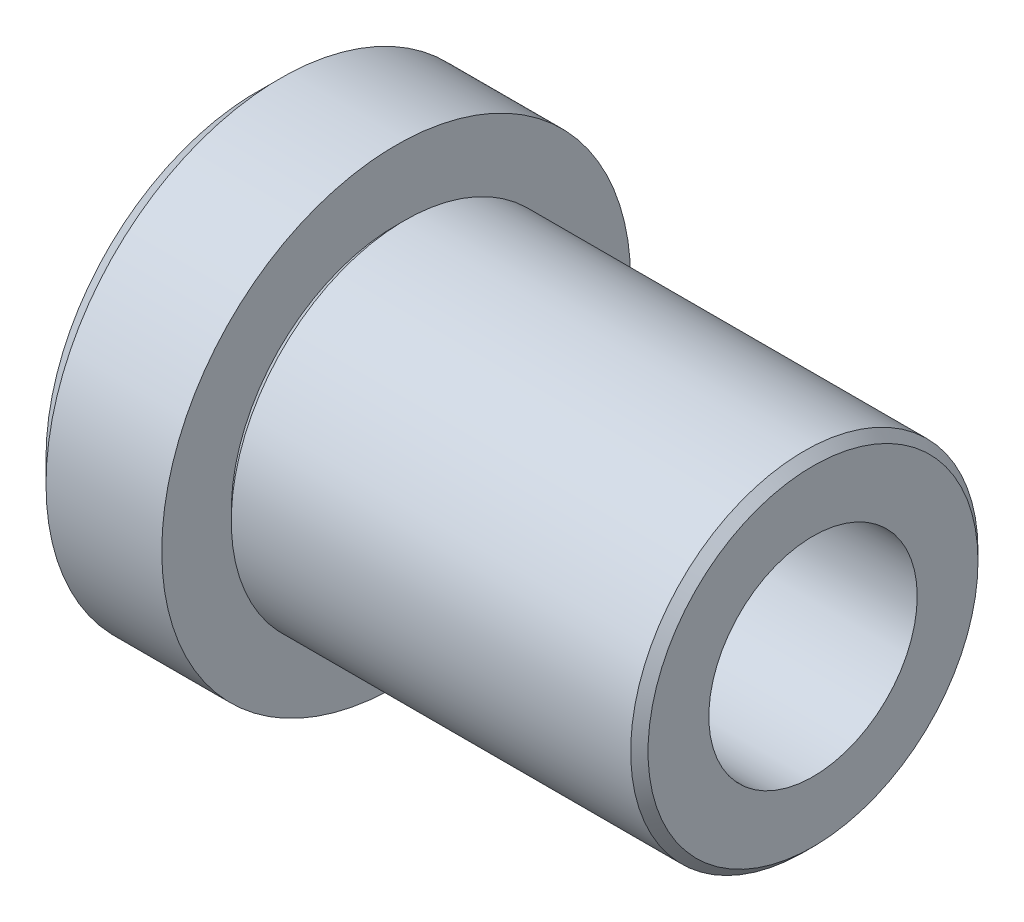
ISO-10303-21;
HEADER;
FILE_DESCRIPTION(('STEP AP214'),'2;1');
FILE_NAME('part.step','',(''),(''),'','','');
FILE_SCHEMA(('AUTOMOTIVE_DESIGN { 1 0 10303 214 1 1 1 1 }'));
ENDSEC;
DATA;
#1=APPLICATION_CONTEXT('core data for automotive mechanical design processes');
#2=APPLICATION_PROTOCOL_DEFINITION('international standard','automotive_design',2000,#1);
#3=PRODUCT_CONTEXT('',#1,'mechanical');
#4=PRODUCT('Part','Part','',(#3));
#5=PRODUCT_RELATED_PRODUCT_CATEGORY('part','',(#4));
#6=PRODUCT_DEFINITION_FORMATION('','',#4);
#7=PRODUCT_DEFINITION_CONTEXT('part definition',#1,'design');
#8=PRODUCT_DEFINITION('design','',#6,#7);
#9=PRODUCT_DEFINITION_SHAPE('','',#8);
#10=(LENGTH_UNIT() NAMED_UNIT(*) SI_UNIT(.MILLI.,.METRE.));
#11=(NAMED_UNIT(*) PLANE_ANGLE_UNIT() SI_UNIT($,.RADIAN.));
#12=(NAMED_UNIT(*) SI_UNIT($,.STERADIAN.) SOLID_ANGLE_UNIT());
#13=UNCERTAINTY_MEASURE_WITH_UNIT(LENGTH_MEASURE(1.E-05),#10,'distance_accuracy_value','');
#14=(GEOMETRIC_REPRESENTATION_CONTEXT(3) GLOBAL_UNCERTAINTY_ASSIGNED_CONTEXT((#13)) GLOBAL_UNIT_ASSIGNED_CONTEXT((#10,
#11,#12)) REPRESENTATION_CONTEXT('',''));
#15=CARTESIAN_POINT('',(0.,0.,0.));
#16=DIRECTION('',(0.,0.,1.));
#17=DIRECTION('',(1.,0.,0.));
#18=AXIS2_PLACEMENT_3D('',#15,#16,#17);
#19=CARTESIAN_POINT('',(6.35,0.,0.));
#20=DIRECTION('',(1.,0.,0.));
#21=DIRECTION('',(0.,0.,-1.));
#22=AXIS2_PLACEMENT_3D('',#19,#20,#21);
#23=CYLINDRICAL_SURFACE('',#22,2.38125);
#24=CARTESIAN_POINT('',(6.35000000000001,0.,0.));
#25=DIRECTION('',(1.,0.,0.));
#26=DIRECTION('',(0.,0.,-1.));
#27=AXIS2_PLACEMENT_3D('',#24,#25,#26);
#28=CIRCLE('',#27,2.38125);
#29=CARTESIAN_POINT('',(6.35000000000001,0.,-2.38125));
#30=VERTEX_POINT('',#29);
#31=EDGE_CURVE('E10',#30,#30,#28,.T.);
#32=ORIENTED_EDGE('',*,*,#31,.T.);
#33=EDGE_LOOP('',(#32));
#34=FACE_BOUND('',#33,.T.);
#35=CARTESIAN_POINT('',(-5.82083333333335,0.,0.));
#36=DIRECTION('',(1.,0.,0.));
#37=DIRECTION('',(0.,0.,-1.));
#38=AXIS2_PLACEMENT_3D('',#35,#36,#37);
#39=CIRCLE('',#38,2.38125);
#40=CARTESIAN_POINT('',(-5.82083333333335,0.,-2.38125));
#41=VERTEX_POINT('',#40);
#42=EDGE_CURVE('E72',#41,#41,#39,.T.);
#43=ORIENTED_EDGE('',*,*,#42,.F.);
#44=EDGE_LOOP('',(#43));
#45=FACE_BOUND('',#44,.T.);
#46=ADVANCED_FACE('F38',(#34,#45),#23,.F.);
#47=CARTESIAN_POINT('',(6.35000000000001,2.38125,0.));
#48=DIRECTION('',(1.,0.,0.));
#49=DIRECTION('',(0.,0.,-1.));
#50=AXIS2_PLACEMENT_3D('',#47,#48,#49);
#51=PLANE('',#50);
#52=CARTESIAN_POINT('',(6.35,0.,0.));
#53=DIRECTION('',(1.,0.,0.));
#54=DIRECTION('',(0.,0.,-1.));
#55=AXIS2_PLACEMENT_3D('',#52,#53,#54);
#56=CIRCLE('',#55,3.7703125);
#57=CARTESIAN_POINT('',(6.35,0.,-3.7703125));
#58=VERTEX_POINT('',#57);
#59=EDGE_CURVE('E44',#58,#58,#56,.T.);
#60=ORIENTED_EDGE('',*,*,#59,.T.);
#61=EDGE_LOOP('',(#60));
#62=FACE_BOUND('',#61,.T.);
#63=ORIENTED_EDGE('',*,*,#31,.F.);
#64=EDGE_LOOP('',(#63));
#65=FACE_BOUND('',#64,.T.);
#66=ADVANCED_FACE('F80',(#62,#65),#51,.T.);
#67=CARTESIAN_POINT('',(6.35,0.,0.));
#68=DIRECTION('',(-1.,0.,0.));
#69=DIRECTION('',(0.,0.,1.));
#70=AXIS2_PLACEMENT_3D('',#67,#68,#69);
#71=CONICAL_SURFACE('',#70,3.7703125,0.785398163397449);
#72=CARTESIAN_POINT('',(6.15156250000001,0.,0.));
#73=DIRECTION('',(1.,0.,0.));
#74=DIRECTION('',(0.,0.,-1.));
#75=AXIS2_PLACEMENT_3D('',#72,#73,#74);
#76=CIRCLE('',#75,3.96875);
#77=CARTESIAN_POINT('',(6.15156250000001,0.,-3.96875));
#78=VERTEX_POINT('',#77);
#79=EDGE_CURVE('E48',#78,#78,#76,.T.);
#80=ORIENTED_EDGE('',*,*,#79,.T.);
#81=EDGE_LOOP('',(#80));
#82=FACE_BOUND('',#81,.T.);
#83=ORIENTED_EDGE('',*,*,#59,.F.);
#84=EDGE_LOOP('',(#83));
#85=FACE_BOUND('',#84,.T.);
#86=ADVANCED_FACE('F84',(#82,#85),#71,.T.);
#87=CARTESIAN_POINT('',(6.35,0.,0.));
#88=DIRECTION('',(1.,0.,0.));
#89=DIRECTION('',(0.,0.,-1.));
#90=AXIS2_PLACEMENT_3D('',#87,#88,#89);
#91=CYLINDRICAL_SURFACE('',#90,3.96875);
#92=CARTESIAN_POINT('',(-2.97656250000001,0.,0.));
#93=DIRECTION('',(1.,0.,0.));
#94=DIRECTION('',(0.,0.,-1.));
#95=AXIS2_PLACEMENT_3D('',#92,#93,#94);
#96=CIRCLE('',#95,3.96875);
#97=CARTESIAN_POINT('',(-2.97656250000001,0.,-3.96875));
#98=VERTEX_POINT('',#97);
#99=EDGE_CURVE('E52',#98,#98,#96,.T.);
#100=ORIENTED_EDGE('',*,*,#99,.T.);
#101=EDGE_LOOP('',(#100));
#102=FACE_BOUND('',#101,.T.);
#103=ORIENTED_EDGE('',*,*,#79,.F.);
#104=EDGE_LOOP('',(#103));
#105=FACE_BOUND('',#104,.T.);
#106=ADVANCED_FACE('F88',(#102,#105),#91,.T.);
#107=CARTESIAN_POINT('',(-2.97656250000001,0.,0.));
#108=DIRECTION('',(1.,0.,0.));
#109=DIRECTION('',(0.,0.,-1.));
#110=AXIS2_PLACEMENT_3D('',#107,#108,#109);
#111=CONICAL_SURFACE('',#110,3.96875,0.785398163397458);
#112=CARTESIAN_POINT('',(-3.175,0.,0.));
#113=DIRECTION('',(1.,0.,0.));
#114=DIRECTION('',(0.,0.,-1.));
#115=AXIS2_PLACEMENT_3D('',#112,#113,#114);
#116=CIRCLE('',#115,3.7703125);
#117=CARTESIAN_POINT('',(-3.175,0.,-3.7703125));
#118=VERTEX_POINT('',#117);
#119=EDGE_CURVE('E57',#118,#118,#116,.T.);
#120=ORIENTED_EDGE('',*,*,#119,.T.);
#121=EDGE_LOOP('',(#120));
#122=FACE_BOUND('',#121,.T.);
#123=ORIENTED_EDGE('',*,*,#99,.F.);
#124=EDGE_LOOP('',(#123));
#125=FACE_BOUND('',#124,.T.);
#126=ADVANCED_FACE('F95',(#122,#125),#111,.T.);
#127=CARTESIAN_POINT('',(-3.175,3.7703125,0.));
#128=DIRECTION('',(1.,0.,0.));
#129=DIRECTION('',(0.,0.,-1.));
#130=AXIS2_PLACEMENT_3D('',#127,#128,#129);
#131=PLANE('',#130);
#132=CARTESIAN_POINT('',(-3.17500000000001,0.,0.));
#133=DIRECTION('',(1.,0.,0.));
#134=DIRECTION('',(0.,0.,-1.));
#135=AXIS2_PLACEMENT_3D('',#132,#133,#134);
#136=CIRCLE('',#135,5.35781249999999);
#137=CARTESIAN_POINT('',(-3.17500000000001,0.,-5.35781249999999));
#138=VERTEX_POINT('',#137);
#139=EDGE_CURVE('E60',#138,#138,#136,.T.);
#140=ORIENTED_EDGE('',*,*,#139,.T.);
#141=EDGE_LOOP('',(#140));
#142=FACE_BOUND('',#141,.T.);
#143=ORIENTED_EDGE('',*,*,#119,.F.);
#144=EDGE_LOOP('',(#143));
#145=FACE_BOUND('',#144,.T.);
#146=ADVANCED_FACE('F99',(#142,#145),#131,.T.);
#147=CARTESIAN_POINT('',(6.35,0.,0.));
#148=DIRECTION('',(1.,0.,0.));
#149=DIRECTION('',(0.,0.,-1.));
#150=AXIS2_PLACEMENT_3D('',#147,#148,#149);
#151=CYLINDRICAL_SURFACE('',#150,5.3578125);
#152=CARTESIAN_POINT('',(-5.82083333333334,0.,0.));
#153=DIRECTION('',(1.,0.,0.));
#154=DIRECTION('',(0.,0.,-1.));
#155=AXIS2_PLACEMENT_3D('',#152,#153,#154);
#156=CIRCLE('',#155,5.3578125);
#157=CARTESIAN_POINT('',(-5.82083333333334,0.,-5.3578125));
#158=VERTEX_POINT('',#157);
#159=EDGE_CURVE('E63',#158,#158,#156,.T.);
#160=ORIENTED_EDGE('',*,*,#159,.T.);
#161=EDGE_LOOP('',(#160));
#162=FACE_BOUND('',#161,.T.);
#163=ORIENTED_EDGE('',*,*,#139,.F.);
#164=EDGE_LOOP('',(#163));
#165=FACE_BOUND('',#164,.T.);
#166=ADVANCED_FACE('F103',(#162,#165),#151,.T.);
#167=CARTESIAN_POINT('',(-5.82083333333334,0.,0.));
#168=DIRECTION('',(1.,0.,0.));
#169=DIRECTION('',(0.,0.,-1.));
#170=AXIS2_PLACEMENT_3D('',#167,#168,#169);
#171=CONICAL_SURFACE('',#170,5.3578125,0.785398163397452);
#172=CARTESIAN_POINT('',(-6.35000000000001,0.,0.));
#173=DIRECTION('',(1.,0.,0.));
#174=DIRECTION('',(0.,0.,-1.));
#175=AXIS2_PLACEMENT_3D('',#172,#173,#174);
#176=CIRCLE('',#175,4.82864583333332);
#177=CARTESIAN_POINT('',(-6.35000000000001,0.,-4.82864583333332));
#178=VERTEX_POINT('',#177);
#179=EDGE_CURVE('E66',#178,#178,#176,.T.);
#180=ORIENTED_EDGE('',*,*,#179,.T.);
#181=EDGE_LOOP('',(#180));
#182=FACE_BOUND('',#181,.T.);
#183=ORIENTED_EDGE('',*,*,#159,.F.);
#184=EDGE_LOOP('',(#183));
#185=FACE_BOUND('',#184,.T.);
#186=ADVANCED_FACE('F107',(#182,#185),#171,.T.);
#187=CARTESIAN_POINT('',(-6.35000000000001,4.82864583333332,0.));
#188=DIRECTION('',(-1.,0.,0.));
#189=DIRECTION('',(0.,0.,1.));
#190=AXIS2_PLACEMENT_3D('',#187,#188,#189);
#191=PLANE('',#190);
#192=CARTESIAN_POINT('',(-6.35000000000001,0.,0.));
#193=DIRECTION('',(1.,0.,0.));
#194=DIRECTION('',(0.,0.,-1.));
#195=AXIS2_PLACEMENT_3D('',#192,#193,#194);
#196=CIRCLE('',#195,2.91041666666666);
#197=CARTESIAN_POINT('',(-6.35000000000001,0.,-2.91041666666666));
#198=VERTEX_POINT('',#197);
#199=EDGE_CURVE('E69',#198,#198,#196,.T.);
#200=ORIENTED_EDGE('',*,*,#199,.T.);
#201=EDGE_LOOP('',(#200));
#202=FACE_BOUND('',#201,.T.);
#203=ORIENTED_EDGE('',*,*,#179,.F.);
#204=EDGE_LOOP('',(#203));
#205=FACE_BOUND('',#204,.T.);
#206=ADVANCED_FACE('F111',(#202,#205),#191,.T.);
#207=CARTESIAN_POINT('',(-6.35000000000001,0.,0.));
#208=DIRECTION('',(-1.,0.,0.));
#209=DIRECTION('',(0.,0.,1.));
#210=AXIS2_PLACEMENT_3D('',#207,#208,#209);
#211=CONICAL_SURFACE('',#210,2.91041666666666,0.78539816339745);
#212=ORIENTED_EDGE('',*,*,#42,.T.);
#213=EDGE_LOOP('',(#212));
#214=FACE_BOUND('',#213,.T.);
#215=ORIENTED_EDGE('',*,*,#199,.F.);
#216=EDGE_LOOP('',(#215));
#217=FACE_BOUND('',#216,.T.);
#218=ADVANCED_FACE('F76',(#214,#217),#211,.F.);
#219=CLOSED_SHELL('',(#46,#66,#86,#106,#126,#146,#166,#186,#206,#218));
#220=MANIFOLD_SOLID_BREP('B2',#219);
#221=ADVANCED_BREP_SHAPE_REPRESENTATION('',(#18,#220),#14);
#222=SHAPE_DEFINITION_REPRESENTATION(#9,#221);
ENDSEC;
END-ISO-10303-21;
